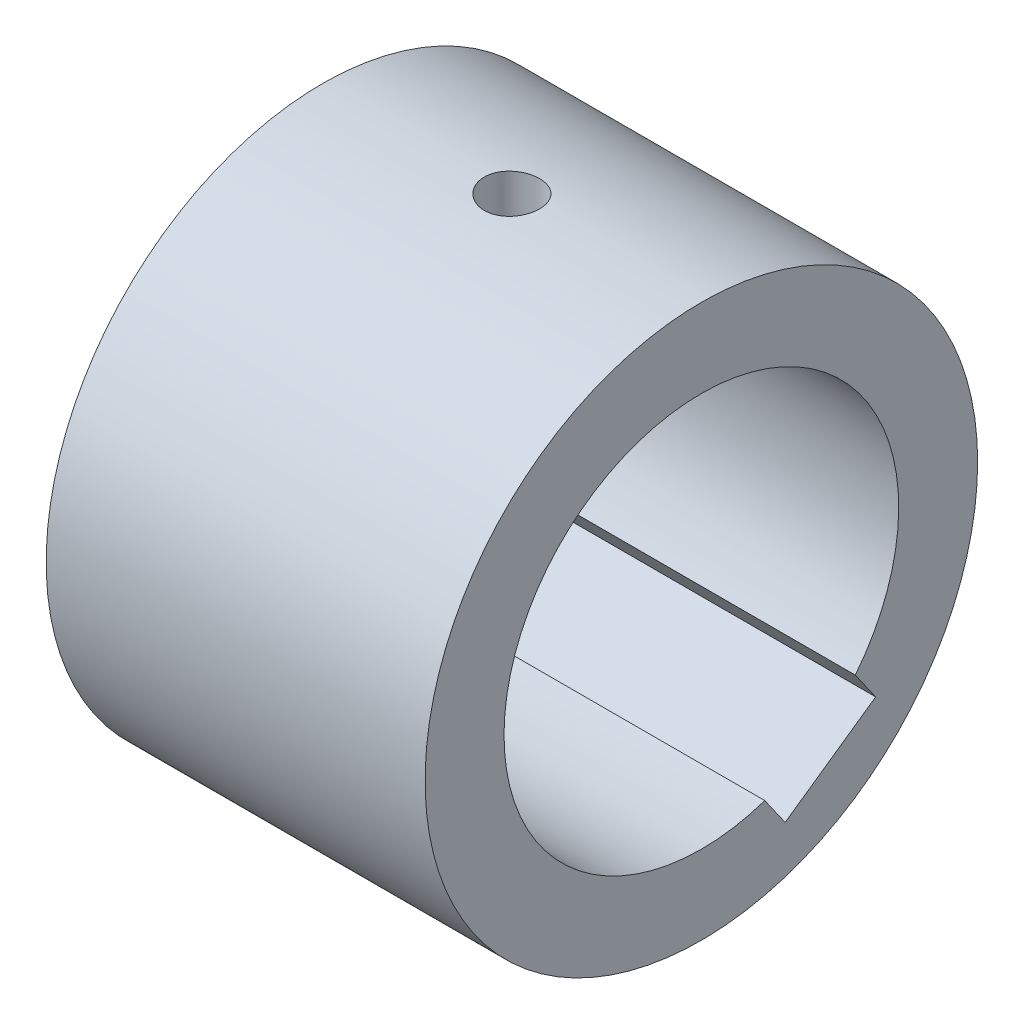
ISO-10303-21;
HEADER;
FILE_DESCRIPTION(('STEP AP214'),'2;1');
FILE_NAME('part.step','',(''),(''),'','','');
FILE_SCHEMA(('AUTOMOTIVE_DESIGN { 1 0 10303 214 1 1 1 1 }'));
ENDSEC;
DATA;
#1=APPLICATION_CONTEXT('core data for automotive mechanical design processes');
#2=APPLICATION_PROTOCOL_DEFINITION('international standard','automotive_design',2000,#1);
#3=PRODUCT_CONTEXT('',#1,'mechanical');
#4=PRODUCT('Part','Part','',(#3));
#5=PRODUCT_RELATED_PRODUCT_CATEGORY('part','',(#4));
#6=PRODUCT_DEFINITION_FORMATION('','',#4);
#7=PRODUCT_DEFINITION_CONTEXT('part definition',#1,'design');
#8=PRODUCT_DEFINITION('design','',#6,#7);
#9=PRODUCT_DEFINITION_SHAPE('','',#8);
#10=(LENGTH_UNIT() NAMED_UNIT(*) SI_UNIT(.MILLI.,.METRE.));
#11=(NAMED_UNIT(*) PLANE_ANGLE_UNIT() SI_UNIT($,.RADIAN.));
#12=(NAMED_UNIT(*) SI_UNIT($,.STERADIAN.) SOLID_ANGLE_UNIT());
#13=UNCERTAINTY_MEASURE_WITH_UNIT(LENGTH_MEASURE(1.E-05),#10,'distance_accuracy_value','');
#14=(GEOMETRIC_REPRESENTATION_CONTEXT(3) GLOBAL_UNCERTAINTY_ASSIGNED_CONTEXT((#13)) GLOBAL_UNIT_ASSIGNED_CONTEXT((#10,
#11,#12)) REPRESENTATION_CONTEXT('',''));
#15=CARTESIAN_POINT('',(0.,0.,0.));
#16=DIRECTION('',(0.,0.,1.));
#17=DIRECTION('',(1.,0.,0.));
#18=AXIS2_PLACEMENT_3D('',#15,#16,#17);
#19=CARTESIAN_POINT('',(24.,0.,0.));
#20=DIRECTION('',(1.,0.,0.));
#21=DIRECTION('',(0.,0.,-1.));
#22=AXIS2_PLACEMENT_3D('',#19,#20,#21);
#23=PLANE('',#22);
#24=DIRECTION('',(0.,0.819152044288985,0.573576436351056));
#25=VECTOR('',#24,1.);
#26=CARTESIAN_POINT('',(24.,-7.91344621185209,-14.0864768120863));
#27=LINE('',#26,#25);
#28=CARTESIAN_POINT('',(24.,-19.3307982077787,-22.080992746028));
#29=VERTEX_POINT('',#28);
#30=CARTESIAN_POINT('',(24.,-15.6446140084783,-19.4998987824482));
#31=VERTEX_POINT('',#30);
#32=EDGE_CURVE('E129',#29,#31,#27,.T.);
#33=ORIENTED_EDGE('',*,*,#32,.F.);
#34=DIRECTION('',(0.,0.573576436351056,-0.819152044288985));
#35=VECTOR('',#34,1.);
#36=CARTESIAN_POINT('',(24.,-19.3307982077787,-22.080992746028));
#37=LINE('',#36,#35);
#38=CARTESIAN_POINT('',(24.,-27.3608683166935,-10.6128641259822));
#39=VERTEX_POINT('',#38);
#40=EDGE_CURVE('E125',#39,#29,#37,.T.);
#41=ORIENTED_EDGE('',*,*,#40,.F.);
#42=DIRECTION('',(0.,-0.819152044288985,-0.573576436351056));
#43=VECTOR('',#42,1.);
#44=CARTESIAN_POINT('',(24.,-27.3608683166935,-10.6128641259822));
#45=LINE('',#44,#43);
#46=CARTESIAN_POINT('',(24.,-23.674684117393,-8.03177016240245));
#47=VERTEX_POINT('',#46);
#48=EDGE_CURVE('E103',#47,#39,#45,.T.);
#49=ORIENTED_EDGE('',*,*,#48,.F.);
#50=CARTESIAN_POINT('',(24.,0.,0.));
#51=DIRECTION('',(1.,0.,0.));
#52=DIRECTION('',(0.,0.,-1.));
#53=AXIS2_PLACEMENT_3D('',#50,#51,#52);
#54=CIRCLE('',#53,25.);
#55=EDGE_CURVE('E139',#31,#47,#54,.T.);
#56=ORIENTED_EDGE('',*,*,#55,.F.);
#57=EDGE_LOOP('',(#33,#41,#49,#56));
#58=FACE_BOUND('',#57,.T.);
#59=CARTESIAN_POINT('',(24.,0.,0.));
#60=DIRECTION('',(1.,0.,0.));
#61=DIRECTION('',(0.,0.,-1.));
#62=AXIS2_PLACEMENT_3D('',#59,#60,#61);
#63=CIRCLE('',#62,35.);
#64=CARTESIAN_POINT('',(24.,0.,-35.));
#65=VERTEX_POINT('',#64);
#66=EDGE_CURVE('E146',#65,#65,#63,.T.);
#67=ORIENTED_EDGE('',*,*,#66,.T.);
#68=EDGE_LOOP('',(#67));
#69=FACE_BOUND('',#68,.T.);
#70=ADVANCED_FACE('F53',(#58,#69),#23,.T.);
#71=CARTESIAN_POINT('',(-24.,0.,0.));
#72=DIRECTION('',(1.,0.,0.));
#73=DIRECTION('',(0.,0.,-1.));
#74=AXIS2_PLACEMENT_3D('',#71,#72,#73);
#75=PLANE('',#74);
#76=CARTESIAN_POINT('',(-24.,0.,0.));
#77=DIRECTION('',(1.,0.,0.));
#78=DIRECTION('',(0.,0.,-1.));
#79=AXIS2_PLACEMENT_3D('',#76,#77,#78);
#80=CIRCLE('',#79,35.);
#81=CARTESIAN_POINT('',(-24.,0.,-35.));
#82=VERTEX_POINT('',#81);
#83=EDGE_CURVE('E143',#82,#82,#80,.T.);
#84=ORIENTED_EDGE('',*,*,#83,.F.);
#85=EDGE_LOOP('',(#84));
#86=FACE_BOUND('',#85,.T.);
#87=DIRECTION('',(0.,0.573576436351056,-0.819152044288985));
#88=VECTOR('',#87,1.);
#89=CARTESIAN_POINT('',(-24.,-19.3307982077787,-22.080992746028));
#90=LINE('',#89,#88);
#91=CARTESIAN_POINT('',(-24.,-27.3608683166935,-10.6128641259822));
#92=VERTEX_POINT('',#91);
#93=CARTESIAN_POINT('',(-24.,-19.3307982077787,-22.080992746028));
#94=VERTEX_POINT('',#93);
#95=EDGE_CURVE('E109',#92,#94,#90,.T.);
#96=ORIENTED_EDGE('',*,*,#95,.T.);
#97=DIRECTION('',(0.,0.819152044288985,0.573576436351056));
#98=VECTOR('',#97,1.);
#99=CARTESIAN_POINT('',(-24.,-7.91344621185209,-14.0864768120863));
#100=LINE('',#99,#98);
#101=CARTESIAN_POINT('',(-24.,-15.6446140084783,-19.4998987824482));
#102=VERTEX_POINT('',#101);
#103=EDGE_CURVE('E121',#94,#102,#100,.T.);
#104=ORIENTED_EDGE('',*,*,#103,.T.);
#105=CARTESIAN_POINT('',(-24.,0.,0.));
#106=DIRECTION('',(1.,0.,0.));
#107=DIRECTION('',(0.,0.,-1.));
#108=AXIS2_PLACEMENT_3D('',#105,#106,#107);
#109=CIRCLE('',#108,25.);
#110=CARTESIAN_POINT('',(-24.,-23.674684117393,-8.03177016240245));
#111=VERTEX_POINT('',#110);
#112=EDGE_CURVE('E119',#102,#111,#109,.T.);
#113=ORIENTED_EDGE('',*,*,#112,.T.);
#114=DIRECTION('',(0.,-0.819152044288985,-0.573576436351056));
#115=VECTOR('',#114,1.);
#116=CARTESIAN_POINT('',(-24.,-27.3608683166935,-10.6128641259822));
#117=LINE('',#116,#115);
#118=EDGE_CURVE('E76',#111,#92,#117,.T.);
#119=ORIENTED_EDGE('',*,*,#118,.T.);
#120=EDGE_LOOP('',(#96,#104,#113,#119));
#121=FACE_BOUND('',#120,.T.);
#122=ADVANCED_FACE('F117',(#86,#121),#75,.F.);
#123=CARTESIAN_POINT('',(24.,0.,0.));
#124=DIRECTION('',(-1.,0.,0.));
#125=DIRECTION('',(0.,0.,1.));
#126=AXIS2_PLACEMENT_3D('',#123,#124,#125);
#127=CYLINDRICAL_SURFACE('',#126,35.);
#128=CARTESIAN_POINT('',(0.,34.8245602987317,3.49999999999988));
#129=CARTESIAN_POINT('',(-0.196068474615196,34.8245625976248,3.4999915068767));
#130=CARTESIAN_POINT('',(-0.392266589464245,34.8262339934706,3.48346900643453));
#131=CARTESIAN_POINT('',(-0.779223152048499,34.8327380631546,3.41780710166835));
#132=CARTESIAN_POINT('',(-0.969975363135411,34.8375742207731,3.36863175210201));
#133=CARTESIAN_POINT('',(-1.34038036725521,34.8498546570279,3.23911040624265));
#134=CARTESIAN_POINT('',(-1.52003981286804,34.8572973542366,3.15878330702893));
#135=CARTESIAN_POINT('',(-1.86328727302312,34.8739503199148,2.96927493586832));
#136=CARTESIAN_POINT('',(-2.02687847069355,34.883160237225,2.86009939469051));
#137=CARTESIAN_POINT('',(-2.33397942280071,34.9023474348731,2.61556666699545));
#138=CARTESIAN_POINT('',(-2.4774225332631,34.9123271001915,2.48012596337881));
#139=CARTESIAN_POINT('',(-2.73958163151263,34.931907683243,2.18708600361832));
#140=CARTESIAN_POINT('',(-2.85829648792213,34.9415085836306,2.02948573417286));
#141=CARTESIAN_POINT('',(-3.06785939952499,34.9592734104481,1.69619226577834));
#142=CARTESIAN_POINT('',(-3.15864849577781,34.9674342813132,1.52046181885337));
#143=CARTESIAN_POINT('',(-3.3094055160204,34.9813735906515,1.15615494500616));
#144=CARTESIAN_POINT('',(-3.36937419129314,34.9871520871971,0.967578831338643));
#145=CARTESIAN_POINT('',(-3.45659268273637,34.995658829986,0.583606739600202));
#146=CARTESIAN_POINT('',(-3.48395191462481,34.9983972744986,0.388235844610414));
#147=CARTESIAN_POINT('',(-3.50551344196801,35.0005500459542,-0.00434259241142233));
#148=CARTESIAN_POINT('',(-3.49971659711196,34.9999644590845,-0.201550086690736));
#149=CARTESIAN_POINT('',(-3.45521934572445,34.9955434958915,-0.591460954226082));
#150=CARTESIAN_POINT('',(-3.41663659552638,34.99171974031,-0.784177904772548));
#151=CARTESIAN_POINT('',(-3.30784604868683,34.9812655242726,-1.16038712826599));
#152=CARTESIAN_POINT('',(-3.2376378412435,34.9746350273584,-1.34387928135217));
#153=CARTESIAN_POINT('',(-3.06746032860946,34.959292811937,-1.69680110137867));
#154=CARTESIAN_POINT('',(-2.96743895864445,34.9505774578015,-1.8662054984359));
#155=CARTESIAN_POINT('',(-2.74051216832271,34.9320434581793,-2.1858672961098));
#156=CARTESIAN_POINT('',(-2.61360595949186,34.9222247803384,-2.33612413496302));
#157=CARTESIAN_POINT('',(-2.33585019670224,34.9025352713748,-2.61391470137953));
#158=CARTESIAN_POINT('',(-2.18489829340448,34.892664400056,-2.74134611166633));
#159=CARTESIAN_POINT('',(-1.86369097176228,34.8740258974878,-2.96907637375283));
#160=CARTESIAN_POINT('',(-1.6934355254175,34.8652582678387,-3.06937518619524));
#161=CARTESIAN_POINT('',(-1.33837541180073,34.8498181329952,-3.23999264600643));
#162=CARTESIAN_POINT('',(-1.15356768651989,34.8431460696394,-3.31030497200548));
#163=CARTESIAN_POINT('',(-0.77468788384859,34.8326615654828,-3.41887257473168));
#164=CARTESIAN_POINT('',(-0.580616088893944,34.8288490375619,-3.45712882810074));
#165=CARTESIAN_POINT('',(-0.189615371646723,34.8245303184596,-3.50036671387198));
#166=CARTESIAN_POINT('',(0.00729757092691552,34.8240099041661,-3.50549148826536));
#167=CARTESIAN_POINT('',(0.39917943038002,34.826296797417,-3.48269686404989));
#168=CARTESIAN_POINT('',(0.594148373491285,34.8291040599971,-3.45477791193426));
#169=CARTESIAN_POINT('',(0.976190537974195,34.8377170547841,-3.36680811077644));
#170=CARTESIAN_POINT('',(1.16327949883131,34.8435164700471,-3.3068249451613));
#171=CARTESIAN_POINT('',(1.52474018105607,34.8574551863578,-3.15649851886591));
#172=CARTESIAN_POINT('',(1.69911161100514,34.8655945410034,-3.06615456274268));
#173=CARTESIAN_POINT('',(2.03083990910072,34.88333045245,-2.85731250498138));
#174=CARTESIAN_POINT('',(2.18813679688189,34.8929318785135,-2.73871954944254));
#175=CARTESIAN_POINT('',(2.48064268645923,34.9124941418815,-2.47688186707923));
#176=CARTESIAN_POINT('',(2.61585114119027,34.9224549880803,-2.33363652986859));
#177=CARTESIAN_POINT('',(2.86083571689332,34.9416566747256,-2.02593931479278));
#178=CARTESIAN_POINT('',(2.97051845855177,34.9508947919416,-1.8614128958932));
#179=CARTESIAN_POINT('',(3.16069553977244,34.9675704737321,-1.51619201096008));
#180=CARTESIAN_POINT('',(3.24119027927486,34.9750080629773,-1.33549776650381));
#181=CARTESIAN_POINT('',(3.37054818679367,34.9872323644902,-0.963396442514975));
#182=CARTESIAN_POINT('',(3.41946775563825,34.9920238011977,-0.77200913177498));
#183=CARTESIAN_POINT('',(3.48447074352945,34.9984353114778,-0.383686848942998));
#184=CARTESIAN_POINT('',(3.50055508541913,35.0000554741798,-0.186752032922882));
#185=CARTESIAN_POINT('',(3.4994180674602,34.9999418409643,0.206157784264988));
#186=CARTESIAN_POINT('',(3.48234167107171,34.998222643183,0.402133225285718));
#187=CARTESIAN_POINT('',(3.41567189020057,34.9916522752161,0.788416609247154));
#188=CARTESIAN_POINT('',(3.36607848019455,34.9868011025722,0.978724547739183));
#189=CARTESIAN_POINT('',(3.23582259912479,34.974510333487,1.34826968068696));
#190=CARTESIAN_POINT('',(3.15516436573066,34.9670710901076,1.52750838127113));
#191=CARTESIAN_POINT('',(2.96508390879036,34.9504334345765,1.86992610054176));
#192=CARTESIAN_POINT('',(2.8556618535503,34.9412350327182,2.03310521319019));
#193=CARTESIAN_POINT('',(2.61061633341766,34.9220614633941,2.33951453549381));
#194=CARTESIAN_POINT('',(2.47488494314616,34.9120832010391,2.48265824176625));
#195=CARTESIAN_POINT('',(2.18128626958798,34.8925006770235,2.74420215787719));
#196=CARTESIAN_POINT('',(2.0234136818972,34.882896505691,2.86259642147227));
#197=CARTESIAN_POINT('',(1.68957480328959,34.8651234190513,3.07151824148024));
#198=CARTESIAN_POINT('',(1.51356351540338,34.8569582161914,3.16197415796529));
#199=CARTESIAN_POINT('',(1.14888098067601,34.8430318155411,3.31192647832916));
#200=CARTESIAN_POINT('',(0.960224286269832,34.8372679076444,3.37145780261068));
#201=CARTESIAN_POINT('',(0.642082906848253,34.8302502639813,3.44302590916929));
#202=CARTESIAN_POINT('',(0.514632120425643,34.828126617742,3.4643619933941));
#203=CARTESIAN_POINT('',(0.258139619352917,34.8252808812256,3.49285180511734));
#204=CARTESIAN_POINT('',(0.129097911383504,34.8245587850651,3.50000559215061));
#205=CARTESIAN_POINT('',(0.,34.8245602987317,3.49999999999988));
#206=B_SPLINE_CURVE_WITH_KNOTS('',3,(#128,#129,#130,#131,#132,#133,#134,#135,#136,#137,#138,
#139,#140,#141,#142,#143,#144,#145,#146,#147,#148,#149,#150,#151,#152,#153,#154,#155,#156,#157,
#158,#159,#160,#161,#162,#163,#164,#165,#166,#167,#168,#169,#170,#171,#172,#173,#174,#175,#176,
#177,#178,#179,#180,#181,#182,#183,#184,#185,#186,#187,#188,#189,#190,#191,#192,#193,#194,#195,
#196,#197,#198,#199,#200,#201,#202,#203,#204,#205),.UNSPECIFIED.,.T.,.F.,(4,2,2,2,2,2,2,2,2,2,2,
2,2,2,2,2,2,2,2,2,2,2,2,2,2,2,2,2,2,2,2,2,2,2,2,2,2,2,4),(0.,0.58773398053861,1.17611603139755,
1.76414171851251,2.35205068149596,2.94186065356873,3.53169760495521,4.12277144901656,
4.71383088429417,5.30290148146709,5.89195680495949,6.47890711367451,7.06586504685546,
7.65385409134583,8.24186038266986,8.8324398779964,9.42302022998605,10.013725019149,
10.6044118108475,11.1925448707931,11.7806699838618,12.3675585146798,12.954460489658,
13.5433616434315,14.1322773803334,14.7233147886555,15.3143440981515,15.904314744324,
16.4942688089816,17.0816496714183,17.6690309949044,18.256332219855,18.8436300083993,
19.4333900263509,20.0232915762297,20.6146934374943,21.2054260213252,21.5924109662468,
21.9793942866687),.UNSPECIFIED.);
#207=CARTESIAN_POINT('',(0.,34.8245602987317,3.49999999999988));
#208=VERTEX_POINT('',#207);
#209=EDGE_CURVE('E132',#208,#208,#206,.T.);
#210=ORIENTED_EDGE('',*,*,#209,.T.);
#211=EDGE_LOOP('',(#210));
#212=FACE_BOUND('',#211,.T.);
#213=ORIENTED_EDGE('',*,*,#66,.F.);
#214=EDGE_LOOP('',(#213));
#215=FACE_BOUND('',#214,.T.);
#216=ORIENTED_EDGE('',*,*,#83,.T.);
#217=EDGE_LOOP('',(#216));
#218=FACE_BOUND('',#217,.T.);
#219=ADVANCED_FACE('F55',(#212,#215,#218),#127,.T.);
#220=CARTESIAN_POINT('',(24.,0.,0.));
#221=DIRECTION('',(-1.,0.,0.));
#222=DIRECTION('',(0.,0.,1.));
#223=AXIS2_PLACEMENT_3D('',#220,#221,#222);
#224=CYLINDRICAL_SURFACE('',#223,25.);
#225=CARTESIAN_POINT('',(0.,24.7537875889731,3.49999999999991));
#226=CARTESIAN_POINT('',(-0.195560154767575,24.7537906822583,3.49999181655899));
#227=CARTESIAN_POINT('',(-0.391237507482555,24.7561300920155,3.48355443558917));
#228=CARTESIAN_POINT('',(-0.777131922734741,24.76522981384,3.41825061741048));
#229=CARTESIAN_POINT('',(-0.967343298780199,24.7719945675026,3.36935159862291));
#230=CARTESIAN_POINT('',(-1.33666359330411,24.7891640928697,3.2406069700329));
#231=CARTESIAN_POINT('',(-1.51578050601989,24.7995662068558,3.16078395095821));
#232=CARTESIAN_POINT('',(-1.85804877360261,24.8228352266466,2.97250847563916));
#233=CARTESIAN_POINT('',(-2.02120254431549,24.8357017586143,2.86406036070275));
#234=CARTESIAN_POINT('',(-2.32808215853283,24.8625504844522,2.62080281251517));
#235=CARTESIAN_POINT('',(-2.47168026194528,24.8765391460462,2.48583292443012));
#236=CARTESIAN_POINT('',(-2.73426680506273,24.9039980636581,2.1937092685364));
#237=CARTESIAN_POINT('',(-2.85325394710894,24.9174682923102,2.03655433171439));
#238=CARTESIAN_POINT('',(-3.06370718457442,24.9424397352459,1.7037092427827));
#239=CARTESIAN_POINT('',(-3.15505643492662,24.9539325035401,1.5279445235744));
#240=CARTESIAN_POINT('',(-3.30689160701615,24.9735826810557,1.16337996516009));
#241=CARTESIAN_POINT('',(-3.36737895417656,24.9817402443171,0.974580728438527));
#242=CARTESIAN_POINT('',(-3.45538823852594,24.9937552741093,0.590618783329255));
#243=CARTESIAN_POINT('',(-3.48312354003459,24.9976405609784,0.39550586551262));
#244=CARTESIAN_POINT('',(-3.50550340939038,25.0007684801016,0.00335922712109844));
#245=CARTESIAN_POINT('',(-3.50014959052891,25.0000113387018,-0.193674399340166));
#246=CARTESIAN_POINT('',(-3.45667267130987,24.9939620558024,-0.582615400058849));
#247=CARTESIAN_POINT('',(-3.41877908235907,24.9887016775951,-0.77454899363336));
#248=CARTESIAN_POINT('',(-3.31165791632868,24.9742724352295,-1.1493059403018));
#249=CARTESIAN_POINT('',(-3.2424296191148,24.9651034812448,-1.33212908391216));
#250=CARTESIAN_POINT('',(-3.07436539311271,24.9438325860369,-1.68417680329696));
#251=CARTESIAN_POINT('',(-2.97543170896317,24.9317209865754,-1.85335410431128));
#252=CARTESIAN_POINT('',(-2.75083632806707,24.9059168552186,-2.17279223786532));
#253=CARTESIAN_POINT('',(-2.6251730960448,24.8922242325342,-2.32305198304032));
#254=CARTESIAN_POINT('',(-2.34940423165519,24.8646488503525,-2.60174071972411));
#255=CARTESIAN_POINT('',(-2.19909835937842,24.8507654670317,-2.72997158820316));
#256=CARTESIAN_POINT('',(-1.87899432350826,24.8244883316295,-2.95941854341821));
#257=CARTESIAN_POINT('',(-1.70919606731678,24.8120945866252,-3.06063450181293));
#258=CARTESIAN_POINT('',(-1.35473337110271,24.7902003566841,-3.23319870278271));
#259=CARTESIAN_POINT('',(-1.17005982427998,24.7807016614096,-3.30452848048132));
#260=CARTESIAN_POINT('',(-0.791192209672886,24.7657059743542,-3.41510621643369));
#261=CARTESIAN_POINT('',(-0.596998723344254,24.7602087384978,-3.45435613146944));
#262=CARTESIAN_POINT('',(-0.206360947689206,24.7538840422246,-3.49939221005379));
#263=CARTESIAN_POINT('',(-0.00994954822496354,24.7530175108533,-3.50545836748379));
#264=CARTESIAN_POINT('',(0.381086893072054,24.755948778245,-3.48469592776285));
#265=CARTESIAN_POINT('',(0.575711982828229,24.7597464515054,-3.45786821570808));
#266=CARTESIAN_POINT('',(0.956795666068332,24.7715424400724,-3.37231633400967));
#267=CARTESIAN_POINT('',(1.14328581530875,24.7795225973313,-3.3137300054231));
#268=CARTESIAN_POINT('',(1.50379762778359,24.7987695354145,-3.16646669264694));
#269=CARTESIAN_POINT('',(1.67781874866506,24.8100364590921,-3.07778840053819));
#270=CARTESIAN_POINT('',(2.00971273491393,24.8346801452907,-2.87217909544431));
#271=CARTESIAN_POINT('',(2.16747168569053,24.8480703159863,-2.75506583601389));
#272=CARTESIAN_POINT('',(2.4611957887449,24.875410682501,-2.49616615385776));
#273=CARTESIAN_POINT('',(2.59715987130254,24.8893609057662,-2.35437852079399));
#274=CARTESIAN_POINT('',(2.84443100323985,24.9163707911093,-2.04892599936437));
#275=CARTESIAN_POINT('',(2.95555315271703,24.9294233048069,-1.8851107059176));
#276=CARTESIAN_POINT('',(3.14870159069414,24.9530578482668,-1.54097657080121));
#277=CARTESIAN_POINT('',(3.2307285895544,24.9636399383426,-1.36065813219238));
#278=CARTESIAN_POINT('',(3.36305865647722,24.9811098395859,-0.989229139282875));
#279=CARTESIAN_POINT('',(3.4134652371279,24.9880096937281,-0.798156053861498));
#280=CARTESIAN_POINT('',(3.4814593912701,24.9973880303632,-0.410154489530087));
#281=CARTESIAN_POINT('',(3.49904884140295,24.9998667656766,-0.21322634609474));
#282=CARTESIAN_POINT('',(3.5008681558451,25.000121613377,0.179096941501349));
#283=CARTESIAN_POINT('',(3.48538184019311,24.9979377352712,0.374490803444288));
#284=CARTESIAN_POINT('',(3.42209452891469,24.9891929064383,0.759868138965443));
#285=CARTESIAN_POINT('',(3.37429359967922,24.9826319647038,0.949851623658541));
#286=CARTESIAN_POINT('',(3.24782988921627,24.9658667061347,1.31895434116059));
#287=CARTESIAN_POINT('',(3.16918424064728,24.9556644121669,1.49807954152811));
#288=CARTESIAN_POINT('',(2.98329332105218,24.9327408556312,1.84063575824949));
#289=CARTESIAN_POINT('',(2.87604736542495,24.9200195327676,2.00406639879774));
#290=CARTESIAN_POINT('',(2.63496342765128,24.8933445340092,2.31203862615948));
#291=CARTESIAN_POINT('',(2.50091509911646,24.8793816286934,2.45641476524119));
#292=CARTESIAN_POINT('',(2.21047306678788,24.8518678878302,2.72072938480244));
#293=CARTESIAN_POINT('',(2.05407411017749,24.8383171500605,2.84066210449918));
#294=CARTESIAN_POINT('',(1.72248429059404,24.8130916210476,3.05319975931045));
#295=CARTESIAN_POINT('',(1.54720581657095,24.801426264232,3.14566908745307));
#296=CARTESIAN_POINT('',(1.18353239989126,24.7814027288131,3.29972220584228));
#297=CARTESIAN_POINT('',(0.995151587980839,24.7730410503233,3.36133869990577));
#298=CARTESIAN_POINT('',(0.671556886996481,24.7625452599898,3.43762752385736));
#299=CARTESIAN_POINT('',(0.538360644804012,24.759278094514,3.46098233554839));
#300=CARTESIAN_POINT('',(0.270128231058788,24.7548982019194,3.49217131855808));
#301=CARTESIAN_POINT('',(0.13509207886887,24.7537854521456,3.50000565308425));
#302=CARTESIAN_POINT('',(0.,24.7537875889731,3.49999999999991));
#303=B_SPLINE_CURVE_WITH_KNOTS('',3,(#225,#226,#227,#228,#229,#230,#231,#232,#233,#234,#235,
#236,#237,#238,#239,#240,#241,#242,#243,#244,#245,#246,#247,#248,#249,#250,#251,#252,#253,#254,
#255,#256,#257,#258,#259,#260,#261,#262,#263,#264,#265,#266,#267,#268,#269,#270,#271,#272,#273,
#274,#275,#276,#277,#278,#279,#280,#281,#282,#283,#284,#285,#286,#287,#288,#289,#290,#291,#292,
#293,#294,#295,#296,#297,#298,#299,#300,#301,#302),.UNSPECIFIED.,.T.,.F.,(4,2,2,2,2,2,2,2,2,2,2,
2,2,2,2,2,2,2,2,2,2,2,2,2,2,2,2,2,2,2,2,2,2,2,2,2,2,2,4),(0.,0.586186802715839,1.17296284945572,
1.75931104800062,2.34557037149055,2.93549224141235,3.52544520813938,4.11785855282521,
4.71024453315484,5.29874972351533,5.88722622097413,6.47158581791365,7.05595884528782,
7.64227642364724,8.22862768766166,8.82000392576343,9.41138297329996,10.0031268615642,
10.5948346524106,11.1815420123042,11.7682335856381,12.3523989110571,12.9365896299306,
13.5246282706496,14.1126957642295,14.7050044334248,15.2972986403631,15.887643653788,
16.4779549074112,17.0632211173544,17.6484861248614,18.233426507049,18.8183808921209,
19.4081201968966,19.997998330098,20.5907424672804,21.1828569621121,21.58779643772,
21.9927316551138),.UNSPECIFIED.);
#304=CARTESIAN_POINT('',(0.,24.7537875889731,3.49999999999991));
#305=VERTEX_POINT('',#304);
#306=EDGE_CURVE('E58',#305,#305,#303,.T.);
#307=ORIENTED_EDGE('',*,*,#306,.F.);
#308=EDGE_LOOP('',(#307));
#309=FACE_BOUND('',#308,.T.);
#310=DIRECTION('',(-1.,0.,0.));
#311=VECTOR('',#310,1.);
#312=CARTESIAN_POINT('',(24.,-15.6446140084782,-19.4998987824482));
#313=LINE('',#312,#311);
#314=EDGE_CURVE('E13',#31,#102,#313,.T.);
#315=ORIENTED_EDGE('',*,*,#314,.F.);
#316=ORIENTED_EDGE('',*,*,#55,.T.);
#317=DIRECTION('',(-1.,0.,0.));
#318=VECTOR('',#317,1.);
#319=CARTESIAN_POINT('',(24.,-23.674684117393,-8.03177016240245));
#320=LINE('',#319,#318);
#321=EDGE_CURVE('E69',#111,#47,#320,.F.);
#322=ORIENTED_EDGE('',*,*,#321,.F.);
#323=ORIENTED_EDGE('',*,*,#112,.F.);
#324=EDGE_LOOP('',(#315,#316,#322,#323));
#325=FACE_BOUND('',#324,.T.);
#326=ADVANCED_FACE('F160',(#309,#325),#224,.F.);
#327=CARTESIAN_POINT('',(-24.,-7.91344621185209,-14.0864768120863));
#328=DIRECTION('',(0.,0.573576436351056,-0.819152044288985));
#329=DIRECTION('',(0.,0.819152044288985,0.573576436351056));
#330=AXIS2_PLACEMENT_3D('',#327,#328,#329);
#331=PLANE('',#330);
#332=ORIENTED_EDGE('',*,*,#314,.T.);
#333=ORIENTED_EDGE('',*,*,#103,.F.);
#334=DIRECTION('',(1.,0.,0.));
#335=VECTOR('',#334,1.);
#336=CARTESIAN_POINT('',(-24.,-19.3307982077787,-22.080992746028));
#337=LINE('',#336,#335);
#338=EDGE_CURVE('E108',#94,#29,#337,.T.);
#339=ORIENTED_EDGE('',*,*,#338,.T.);
#340=ORIENTED_EDGE('',*,*,#32,.T.);
#341=EDGE_LOOP('',(#332,#333,#339,#340));
#342=FACE_BOUND('',#341,.T.);
#343=ADVANCED_FACE('F162',(#342),#331,.F.);
#344=CARTESIAN_POINT('',(-24.,-19.3307982077787,-22.080992746028));
#345=DIRECTION('',(0.,-0.819152044288985,-0.573576436351056));
#346=DIRECTION('',(0.,0.573576436351056,-0.819152044288985));
#347=AXIS2_PLACEMENT_3D('',#344,#345,#346);
#348=PLANE('',#347);
#349=ORIENTED_EDGE('',*,*,#40,.T.);
#350=ORIENTED_EDGE('',*,*,#338,.F.);
#351=ORIENTED_EDGE('',*,*,#95,.F.);
#352=DIRECTION('',(1.,0.,0.));
#353=VECTOR('',#352,1.);
#354=CARTESIAN_POINT('',(-24.,-27.3608683166935,-10.6128641259822));
#355=LINE('',#354,#353);
#356=EDGE_CURVE('E99',#92,#39,#355,.T.);
#357=ORIENTED_EDGE('',*,*,#356,.T.);
#358=EDGE_LOOP('',(#349,#350,#351,#357));
#359=FACE_BOUND('',#358,.T.);
#360=ADVANCED_FACE('F112',(#359),#348,.F.);
#361=CARTESIAN_POINT('',(-24.,-27.3608683166935,-10.6128641259822));
#362=DIRECTION('',(0.,-0.573576436351056,0.819152044288985));
#363=DIRECTION('',(0.,-0.819152044288985,-0.573576436351056));
#364=AXIS2_PLACEMENT_3D('',#361,#362,#363);
#365=PLANE('',#364);
#366=ORIENTED_EDGE('',*,*,#321,.T.);
#367=ORIENTED_EDGE('',*,*,#48,.T.);
#368=ORIENTED_EDGE('',*,*,#356,.F.);
#369=ORIENTED_EDGE('',*,*,#118,.F.);
#370=EDGE_LOOP('',(#366,#367,#368,#369));
#371=FACE_BOUND('',#370,.T.);
#372=ADVANCED_FACE('F101',(#371),#365,.F.);
#373=CARTESIAN_POINT('',(0.,11.,0.));
#374=DIRECTION('',(0.,1.,0.));
#375=DIRECTION('',(0.,0.,1.));
#376=AXIS2_PLACEMENT_3D('',#373,#374,#375);
#377=CYLINDRICAL_SURFACE('',#376,3.5);
#378=ORIENTED_EDGE('',*,*,#306,.T.);
#379=EDGE_LOOP('',(#378));
#380=FACE_BOUND('',#379,.T.);
#381=ORIENTED_EDGE('',*,*,#209,.F.);
#382=EDGE_LOOP('',(#381));
#383=FACE_BOUND('',#382,.T.);
#384=ADVANCED_FACE('F214',(#380,#383),#377,.F.);
#385=CLOSED_SHELL('',(#70,#122,#219,#326,#343,#360,#372,#384));
#386=MANIFOLD_SOLID_BREP('B2',#385);
#387=ADVANCED_BREP_SHAPE_REPRESENTATION('',(#18,#386),#14);
#388=SHAPE_DEFINITION_REPRESENTATION(#9,#387);
ENDSEC;
END-ISO-10303-21;
